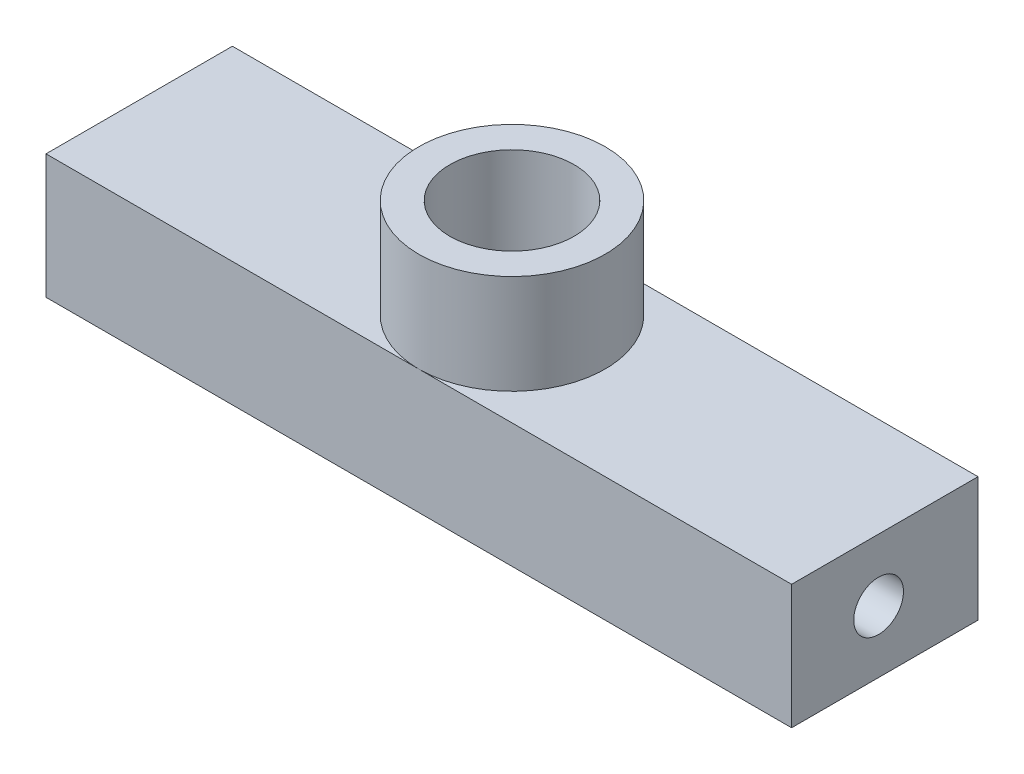
ISO-10303-21;
HEADER;
FILE_DESCRIPTION(('STEP AP214'),'2;1');
FILE_NAME('part.step','',(''),(''),'','','');
FILE_SCHEMA(('AUTOMOTIVE_DESIGN { 1 0 10303 214 1 1 1 1 }'));
ENDSEC;
DATA;
#1=APPLICATION_CONTEXT('core data for automotive mechanical design processes');
#2=APPLICATION_PROTOCOL_DEFINITION('international standard','automotive_design',2000,#1);
#3=PRODUCT_CONTEXT('',#1,'mechanical');
#4=PRODUCT('Part','Part','',(#3));
#5=PRODUCT_RELATED_PRODUCT_CATEGORY('part','',(#4));
#6=PRODUCT_DEFINITION_FORMATION('','',#4);
#7=PRODUCT_DEFINITION_CONTEXT('part definition',#1,'design');
#8=PRODUCT_DEFINITION('design','',#6,#7);
#9=PRODUCT_DEFINITION_SHAPE('','',#8);
#10=(LENGTH_UNIT() NAMED_UNIT(*) SI_UNIT(.MILLI.,.METRE.));
#11=(NAMED_UNIT(*) PLANE_ANGLE_UNIT() SI_UNIT($,.RADIAN.));
#12=(NAMED_UNIT(*) SI_UNIT($,.STERADIAN.) SOLID_ANGLE_UNIT());
#13=UNCERTAINTY_MEASURE_WITH_UNIT(LENGTH_MEASURE(1.E-05),#10,'distance_accuracy_value','');
#14=(GEOMETRIC_REPRESENTATION_CONTEXT(3) GLOBAL_UNCERTAINTY_ASSIGNED_CONTEXT((#13)) GLOBAL_UNIT_ASSIGNED_CONTEXT((#10,
#11,#12)) REPRESENTATION_CONTEXT('',''));
#15=CARTESIAN_POINT('',(0.,0.,0.));
#16=DIRECTION('',(0.,0.,1.));
#17=DIRECTION('',(1.,0.,0.));
#18=AXIS2_PLACEMENT_3D('',#15,#16,#17);
#19=CARTESIAN_POINT('',(0.,9.,0.));
#20=DIRECTION('',(0.,-1.,0.));
#21=DIRECTION('',(0.,0.,-1.));
#22=AXIS2_PLACEMENT_3D('',#19,#20,#21);
#23=CYLINDRICAL_SURFACE('',#22,1.75);
#24=CARTESIAN_POINT('',(0.,5.,0.));
#25=DIRECTION('',(0.,1.,0.));
#26=DIRECTION('',(0.,0.,1.));
#27=AXIS2_PLACEMENT_3D('',#24,#25,#26);
#28=CIRCLE('',#27,1.75);
#29=CARTESIAN_POINT('',(0.,5.,1.75));
#30=VERTEX_POINT('',#29);
#31=EDGE_CURVE('E181',#30,#30,#28,.T.);
#32=ORIENTED_EDGE('',*,*,#31,.T.);
#33=EDGE_LOOP('',(#32));
#34=FACE_BOUND('',#33,.T.);
#35=CARTESIAN_POINT('',(0.,4.,0.));
#36=DIRECTION('',(0.,-1.,0.));
#37=DIRECTION('',(0.,0.,-1.));
#38=AXIS2_PLACEMENT_3D('',#35,#36,#37);
#39=CIRCLE('',#38,1.75);
#40=CARTESIAN_POINT('',(0.,4.,-1.75));
#41=VERTEX_POINT('',#40);
#42=EDGE_CURVE('E37',#41,#41,#39,.F.);
#43=ORIENTED_EDGE('',*,*,#42,.F.);
#44=EDGE_LOOP('',(#43));
#45=FACE_BOUND('',#44,.T.);
#46=ADVANCED_FACE('F33',(#34,#45),#23,.F.);
#47=CARTESIAN_POINT('',(0.,5.,0.));
#48=DIRECTION('',(0.,1.,0.));
#49=DIRECTION('',(0.,0.,1.));
#50=AXIS2_PLACEMENT_3D('',#47,#48,#49);
#51=PLANE('',#50);
#52=CARTESIAN_POINT('',(0.,5.,0.));
#53=DIRECTION('',(0.,1.,0.));
#54=DIRECTION('',(0.,0.,1.));
#55=AXIS2_PLACEMENT_3D('',#52,#53,#54);
#56=CIRCLE('',#55,3.75);
#57=CARTESIAN_POINT('',(0.,5.,3.75));
#58=VERTEX_POINT('',#57);
#59=CARTESIAN_POINT('',(0.,5.,-3.75));
#60=VERTEX_POINT('',#59);
#61=EDGE_CURVE('E44',#58,#60,#56,.T.);
#62=ORIENTED_EDGE('',*,*,#61,.F.);
#63=DIRECTION('',(1.,0.,0.));
#64=VECTOR('',#63,1.);
#65=CARTESIAN_POINT('',(-15.,5.,3.75));
#66=LINE('',#65,#64);
#67=CARTESIAN_POINT('',(15.,5.,3.75));
#68=VERTEX_POINT('',#67);
#69=EDGE_CURVE('E58',#58,#68,#66,.T.);
#70=ORIENTED_EDGE('',*,*,#69,.T.);
#71=DIRECTION('',(0.,0.,-1.));
#72=VECTOR('',#71,1.);
#73=CARTESIAN_POINT('',(15.,5.,-3.75));
#74=LINE('',#73,#72);
#75=CARTESIAN_POINT('',(15.,5.,-3.75));
#76=VERTEX_POINT('',#75);
#77=EDGE_CURVE('E185',#68,#76,#74,.T.);
#78=ORIENTED_EDGE('',*,*,#77,.T.);
#79=DIRECTION('',(-1.,0.,0.));
#80=VECTOR('',#79,1.);
#81=CARTESIAN_POINT('',(-15.,5.,-3.75));
#82=LINE('',#81,#80);
#83=EDGE_CURVE('E87',#76,#60,#82,.T.);
#84=ORIENTED_EDGE('',*,*,#83,.T.);
#85=EDGE_LOOP('',(#62,#70,#78,#84));
#86=FACE_BOUND('',#85,.T.);
#87=ADVANCED_FACE('F100',(#86),#51,.T.);
#88=CARTESIAN_POINT('',(15.,5.,-3.75));
#89=DIRECTION('',(-1.,0.,0.));
#90=DIRECTION('',(0.,0.,1.));
#91=AXIS2_PLACEMENT_3D('',#88,#89,#90);
#92=PLANE('',#91);
#93=CARTESIAN_POINT('',(15.,2.5,0.25));
#94=DIRECTION('',(1.,0.,0.));
#95=DIRECTION('',(0.,0.,-1.));
#96=AXIS2_PLACEMENT_3D('',#93,#94,#95);
#97=CIRCLE('',#96,1.);
#98=CARTESIAN_POINT('',(15.,2.5,-0.75));
#99=VERTEX_POINT('',#98);
#100=EDGE_CURVE('E159',#99,#99,#97,.T.);
#101=ORIENTED_EDGE('',*,*,#100,.F.);
#102=EDGE_LOOP('',(#101));
#103=FACE_BOUND('',#102,.T.);
#104=DIRECTION('',(0.,0.,-1.));
#105=VECTOR('',#104,1.);
#106=CARTESIAN_POINT('',(15.,0.,-3.75));
#107=LINE('',#106,#105);
#108=CARTESIAN_POINT('',(15.,0.,3.75));
#109=VERTEX_POINT('',#108);
#110=CARTESIAN_POINT('',(15.,0.,-3.75));
#111=VERTEX_POINT('',#110);
#112=EDGE_CURVE('E183',#109,#111,#107,.T.);
#113=ORIENTED_EDGE('',*,*,#112,.T.);
#114=DIRECTION('',(0.,-1.,0.));
#115=VECTOR('',#114,1.);
#116=CARTESIAN_POINT('',(15.,5.,-3.75));
#117=LINE('',#116,#115);
#118=EDGE_CURVE('E42',#76,#111,#117,.T.);
#119=ORIENTED_EDGE('',*,*,#118,.F.);
#120=ORIENTED_EDGE('',*,*,#77,.F.);
#121=DIRECTION('',(0.,-1.,0.));
#122=VECTOR('',#121,1.);
#123=CARTESIAN_POINT('',(15.,5.,3.75));
#124=LINE('',#123,#122);
#125=EDGE_CURVE('E95',#68,#109,#124,.T.);
#126=ORIENTED_EDGE('',*,*,#125,.T.);
#127=EDGE_LOOP('',(#113,#119,#120,#126));
#128=FACE_BOUND('',#127,.T.);
#129=ADVANCED_FACE('F35',(#103,#128),#92,.F.);
#130=CARTESIAN_POINT('',(-15.,5.,-3.75));
#131=DIRECTION('',(0.,0.,1.));
#132=DIRECTION('',(1.,0.,0.));
#133=AXIS2_PLACEMENT_3D('',#130,#131,#132);
#134=PLANE('',#133);
#135=DIRECTION('',(-1.,0.,0.));
#136=VECTOR('',#135,1.);
#137=CARTESIAN_POINT('',(-15.,0.,-3.75));
#138=LINE('',#137,#136);
#139=CARTESIAN_POINT('',(-15.,0.,-3.75));
#140=VERTEX_POINT('',#139);
#141=EDGE_CURVE('E192',#111,#140,#138,.T.);
#142=ORIENTED_EDGE('',*,*,#141,.T.);
#143=DIRECTION('',(0.,-1.,0.));
#144=VECTOR('',#143,1.);
#145=CARTESIAN_POINT('',(-15.,5.,-3.75));
#146=LINE('',#145,#144);
#147=CARTESIAN_POINT('',(-15.,5.,-3.75));
#148=VERTEX_POINT('',#147);
#149=EDGE_CURVE('E200',#148,#140,#146,.T.);
#150=ORIENTED_EDGE('',*,*,#149,.F.);
#151=EDGE_CURVE('E187',#60,#148,#82,.T.);
#152=ORIENTED_EDGE('',*,*,#151,.F.);
#153=ORIENTED_EDGE('',*,*,#83,.F.);
#154=ORIENTED_EDGE('',*,*,#118,.T.);
#155=EDGE_LOOP('',(#142,#150,#152,#153,#154));
#156=FACE_BOUND('',#155,.T.);
#157=ADVANCED_FACE('F226',(#156),#134,.F.);
#158=CARTESIAN_POINT('',(-15.,5.,-3.75));
#159=DIRECTION('',(1.,0.,0.));
#160=DIRECTION('',(0.,0.,-1.));
#161=AXIS2_PLACEMENT_3D('',#158,#159,#160);
#162=PLANE('',#161);
#163=CARTESIAN_POINT('',(-15.,2.5,0.250000000000007));
#164=DIRECTION('',(-1.,0.,0.));
#165=DIRECTION('',(0.,0.,1.));
#166=AXIS2_PLACEMENT_3D('',#163,#164,#165);
#167=CIRCLE('',#166,1.);
#168=CARTESIAN_POINT('',(-15.,2.5,1.25000000000001));
#169=VERTEX_POINT('',#168);
#170=EDGE_CURVE('E160',#169,#169,#167,.T.);
#171=ORIENTED_EDGE('',*,*,#170,.F.);
#172=EDGE_LOOP('',(#171));
#173=FACE_BOUND('',#172,.T.);
#174=DIRECTION('',(0.,0.,1.));
#175=VECTOR('',#174,1.);
#176=CARTESIAN_POINT('',(-15.,0.,-3.75));
#177=LINE('',#176,#175);
#178=CARTESIAN_POINT('',(-15.,0.,3.75));
#179=VERTEX_POINT('',#178);
#180=EDGE_CURVE('E194',#140,#179,#177,.T.);
#181=ORIENTED_EDGE('',*,*,#180,.T.);
#182=DIRECTION('',(0.,-1.,0.));
#183=VECTOR('',#182,1.);
#184=CARTESIAN_POINT('',(-15.,5.,3.75));
#185=LINE('',#184,#183);
#186=CARTESIAN_POINT('',(-15.,5.,3.75));
#187=VERTEX_POINT('',#186);
#188=EDGE_CURVE('E198',#187,#179,#185,.T.);
#189=ORIENTED_EDGE('',*,*,#188,.F.);
#190=DIRECTION('',(0.,0.,1.));
#191=VECTOR('',#190,1.);
#192=CARTESIAN_POINT('',(-15.,5.,-3.75));
#193=LINE('',#192,#191);
#194=EDGE_CURVE('E93',#148,#187,#193,.T.);
#195=ORIENTED_EDGE('',*,*,#194,.F.);
#196=ORIENTED_EDGE('',*,*,#149,.T.);
#197=EDGE_LOOP('',(#181,#189,#195,#196));
#198=FACE_BOUND('',#197,.T.);
#199=ADVANCED_FACE('F221',(#173,#198),#162,.F.);
#200=CARTESIAN_POINT('',(-15.,5.,3.75));
#201=DIRECTION('',(0.,0.,-1.));
#202=DIRECTION('',(-1.,0.,0.));
#203=AXIS2_PLACEMENT_3D('',#200,#201,#202);
#204=PLANE('',#203);
#205=DIRECTION('',(1.,0.,0.));
#206=VECTOR('',#205,1.);
#207=CARTESIAN_POINT('',(-15.,0.,3.75));
#208=LINE('',#207,#206);
#209=EDGE_CURVE('E80',#179,#109,#208,.T.);
#210=ORIENTED_EDGE('',*,*,#209,.T.);
#211=ORIENTED_EDGE('',*,*,#125,.F.);
#212=ORIENTED_EDGE('',*,*,#69,.F.);
#213=EDGE_CURVE('E90',#187,#58,#66,.T.);
#214=ORIENTED_EDGE('',*,*,#213,.F.);
#215=ORIENTED_EDGE('',*,*,#188,.T.);
#216=EDGE_LOOP('',(#210,#211,#212,#214,#215));
#217=FACE_BOUND('',#216,.T.);
#218=ADVANCED_FACE('F97',(#217),#204,.F.);
#219=EDGE_CURVE('E11',#60,#58,#56,.T.);
#220=ORIENTED_EDGE('',*,*,#219,.F.);
#221=ORIENTED_EDGE('',*,*,#151,.T.);
#222=ORIENTED_EDGE('',*,*,#194,.T.);
#223=ORIENTED_EDGE('',*,*,#213,.T.);
#224=EDGE_LOOP('',(#220,#221,#222,#223));
#225=FACE_BOUND('',#224,.T.);
#226=ADVANCED_FACE('F91',(#225),#51,.T.);
#227=CARTESIAN_POINT('',(0.,0.,0.));
#228=DIRECTION('',(0.,1.,0.));
#229=DIRECTION('',(0.,0.,1.));
#230=AXIS2_PLACEMENT_3D('',#227,#228,#229);
#231=PLANE('',#230);
#232=CARTESIAN_POINT('',(0.,0.,0.));
#233=DIRECTION('',(0.,-1.,0.));
#234=DIRECTION('',(0.,0.,-1.));
#235=AXIS2_PLACEMENT_3D('',#232,#233,#234);
#236=CIRCLE('',#235,2.5);
#237=CARTESIAN_POINT('',(0.,0.,-2.5));
#238=VERTEX_POINT('',#237);
#239=EDGE_CURVE('E169',#238,#238,#236,.T.);
#240=ORIENTED_EDGE('',*,*,#239,.F.);
#241=EDGE_LOOP('',(#240));
#242=FACE_BOUND('',#241,.T.);
#243=ORIENTED_EDGE('',*,*,#112,.F.);
#244=ORIENTED_EDGE('',*,*,#209,.F.);
#245=ORIENTED_EDGE('',*,*,#180,.F.);
#246=ORIENTED_EDGE('',*,*,#141,.F.);
#247=EDGE_LOOP('',(#243,#244,#245,#246));
#248=FACE_BOUND('',#247,.T.);
#249=ADVANCED_FACE('F117',(#242,#248),#231,.F.);
#250=CARTESIAN_POINT('',(0.,9.,0.));
#251=DIRECTION('',(0.,1.,0.));
#252=DIRECTION('',(0.,0.,1.));
#253=AXIS2_PLACEMENT_3D('',#250,#251,#252);
#254=PLANE('',#253);
#255=CARTESIAN_POINT('',(0.,9.,0.));
#256=DIRECTION('',(0.,1.,0.));
#257=DIRECTION('',(0.,0.,1.));
#258=AXIS2_PLACEMENT_3D('',#255,#256,#257);
#259=CIRCLE('',#258,3.75);
#260=CARTESIAN_POINT('',(0.,9.,3.75));
#261=VERTEX_POINT('',#260);
#262=EDGE_CURVE('E102',#261,#261,#259,.T.);
#263=ORIENTED_EDGE('',*,*,#262,.T.);
#264=EDGE_LOOP('',(#263));
#265=FACE_BOUND('',#264,.T.);
#266=CARTESIAN_POINT('',(0.,9.,0.));
#267=DIRECTION('',(0.,1.,0.));
#268=DIRECTION('',(0.,0.,1.));
#269=AXIS2_PLACEMENT_3D('',#266,#267,#268);
#270=CIRCLE('',#269,2.5);
#271=CARTESIAN_POINT('',(0.,9.,2.5));
#272=VERTEX_POINT('',#271);
#273=EDGE_CURVE('E103',#272,#272,#270,.T.);
#274=ORIENTED_EDGE('',*,*,#273,.F.);
#275=EDGE_LOOP('',(#274));
#276=FACE_BOUND('',#275,.T.);
#277=ADVANCED_FACE('F107',(#265,#276),#254,.T.);
#278=CARTESIAN_POINT('',(0.,9.,0.));
#279=DIRECTION('',(0.,-1.,0.));
#280=DIRECTION('',(0.,0.,-1.));
#281=AXIS2_PLACEMENT_3D('',#278,#279,#280);
#282=CYLINDRICAL_SURFACE('',#281,3.75);
#283=ORIENTED_EDGE('',*,*,#262,.F.);
#284=EDGE_LOOP('',(#283));
#285=FACE_BOUND('',#284,.T.);
#286=ORIENTED_EDGE('',*,*,#61,.T.);
#287=ORIENTED_EDGE('',*,*,#219,.T.);
#288=EDGE_LOOP('',(#286,#287));
#289=FACE_BOUND('',#288,.T.);
#290=ADVANCED_FACE('F104',(#285,#289),#282,.T.);
#291=CARTESIAN_POINT('',(0.,9.,0.));
#292=DIRECTION('',(0.,-1.,0.));
#293=DIRECTION('',(0.,0.,-1.));
#294=AXIS2_PLACEMENT_3D('',#291,#292,#293);
#295=CYLINDRICAL_SURFACE('',#294,2.5);
#296=ORIENTED_EDGE('',*,*,#273,.T.);
#297=EDGE_LOOP('',(#296));
#298=FACE_BOUND('',#297,.T.);
#299=CARTESIAN_POINT('',(0.,5.,0.));
#300=DIRECTION('',(0.,1.,0.));
#301=DIRECTION('',(0.,0.,1.));
#302=AXIS2_PLACEMENT_3D('',#299,#300,#301);
#303=CIRCLE('',#302,2.5);
#304=CARTESIAN_POINT('',(0.,5.,2.5));
#305=VERTEX_POINT('',#304);
#306=EDGE_CURVE('E178',#305,#305,#303,.T.);
#307=ORIENTED_EDGE('',*,*,#306,.F.);
#308=EDGE_LOOP('',(#307));
#309=FACE_BOUND('',#308,.T.);
#310=ADVANCED_FACE('F106',(#298,#309),#295,.F.);
#311=ORIENTED_EDGE('',*,*,#31,.F.);
#312=EDGE_LOOP('',(#311));
#313=FACE_BOUND('',#312,.T.);
#314=ORIENTED_EDGE('',*,*,#306,.T.);
#315=EDGE_LOOP('',(#314));
#316=FACE_BOUND('',#315,.T.);
#317=ADVANCED_FACE('F114',(#313,#316),#51,.T.);
#318=CARTESIAN_POINT('',(0.,4.,0.));
#319=DIRECTION('',(0.,-1.,0.));
#320=DIRECTION('',(0.,0.,-1.));
#321=AXIS2_PLACEMENT_3D('',#318,#319,#320);
#322=PLANE('',#321);
#323=CARTESIAN_POINT('',(0.,4.,0.));
#324=DIRECTION('',(0.,-1.,0.));
#325=DIRECTION('',(0.,0.,-1.));
#326=AXIS2_PLACEMENT_3D('',#323,#324,#325);
#327=CIRCLE('',#326,2.5);
#328=CARTESIAN_POINT('',(0.,4.,-2.5));
#329=VERTEX_POINT('',#328);
#330=EDGE_CURVE('E171',#329,#329,#327,.T.);
#331=ORIENTED_EDGE('',*,*,#330,.T.);
#332=EDGE_LOOP('',(#331));
#333=FACE_BOUND('',#332,.T.);
#334=ORIENTED_EDGE('',*,*,#42,.T.);
#335=EDGE_LOOP('',(#334));
#336=FACE_BOUND('',#335,.T.);
#337=ADVANCED_FACE('F135',(#333,#336),#322,.T.);
#338=CARTESIAN_POINT('',(0.,4.,0.));
#339=DIRECTION('',(0.,-1.,0.));
#340=DIRECTION('',(0.,0.,-1.));
#341=AXIS2_PLACEMENT_3D('',#338,#339,#340);
#342=CYLINDRICAL_SURFACE('',#341,2.5);
#343=ORIENTED_EDGE('',*,*,#330,.F.);
#344=EDGE_LOOP('',(#343));
#345=FACE_BOUND('',#344,.T.);
#346=ORIENTED_EDGE('',*,*,#239,.T.);
#347=EDGE_LOOP('',(#346));
#348=FACE_BOUND('',#347,.T.);
#349=ADVANCED_FACE('F131',(#345,#348),#342,.F.);
#350=CARTESIAN_POINT('',(5.,2.5,0.25));
#351=DIRECTION('',(1.,0.,0.));
#352=DIRECTION('',(0.,0.,-1.));
#353=AXIS2_PLACEMENT_3D('',#350,#351,#352);
#354=CYLINDRICAL_SURFACE('',#353,1.);
#355=CARTESIAN_POINT('',(5.,2.5,0.25));
#356=DIRECTION('',(1.,0.,0.));
#357=DIRECTION('',(0.,0.,-1.));
#358=AXIS2_PLACEMENT_3D('',#355,#356,#357);
#359=CIRCLE('',#358,1.);
#360=CARTESIAN_POINT('',(5.,2.5,-0.75));
#361=VERTEX_POINT('',#360);
#362=EDGE_CURVE('E163',#361,#361,#359,.T.);
#363=ORIENTED_EDGE('',*,*,#362,.F.);
#364=EDGE_LOOP('',(#363));
#365=FACE_BOUND('',#364,.T.);
#366=ORIENTED_EDGE('',*,*,#100,.T.);
#367=EDGE_LOOP('',(#366));
#368=FACE_BOUND('',#367,.T.);
#369=ADVANCED_FACE('F134',(#365,#368),#354,.F.);
#370=CARTESIAN_POINT('',(5.,2.5,0.25));
#371=DIRECTION('',(1.,0.,0.));
#372=DIRECTION('',(0.,0.,-1.));
#373=AXIS2_PLACEMENT_3D('',#370,#371,#372);
#374=PLANE('',#373);
#375=ORIENTED_EDGE('',*,*,#362,.T.);
#376=EDGE_LOOP('',(#375));
#377=FACE_BOUND('',#376,.T.);
#378=ADVANCED_FACE('F142',(#377),#374,.T.);
#379=CARTESIAN_POINT('',(-5.,2.5,0.250000000000003));
#380=DIRECTION('',(-1.,0.,0.));
#381=DIRECTION('',(0.,0.,1.));
#382=AXIS2_PLACEMENT_3D('',#379,#380,#381);
#383=CYLINDRICAL_SURFACE('',#382,1.);
#384=CARTESIAN_POINT('',(-5.,2.5,0.250000000000003));
#385=DIRECTION('',(-1.,0.,0.));
#386=DIRECTION('',(0.,0.,1.));
#387=AXIS2_PLACEMENT_3D('',#384,#385,#386);
#388=CIRCLE('',#387,1.);
#389=CARTESIAN_POINT('',(-5.,2.5,1.25));
#390=VERTEX_POINT('',#389);
#391=EDGE_CURVE('E158',#390,#390,#388,.T.);
#392=ORIENTED_EDGE('',*,*,#391,.F.);
#393=EDGE_LOOP('',(#392));
#394=FACE_BOUND('',#393,.T.);
#395=ORIENTED_EDGE('',*,*,#170,.T.);
#396=EDGE_LOOP('',(#395));
#397=FACE_BOUND('',#396,.T.);
#398=ADVANCED_FACE('F146',(#394,#397),#383,.F.);
#399=CARTESIAN_POINT('',(-5.,2.5,0.250000000000003));
#400=DIRECTION('',(-1.,0.,0.));
#401=DIRECTION('',(0.,0.,1.));
#402=AXIS2_PLACEMENT_3D('',#399,#400,#401);
#403=PLANE('',#402);
#404=ORIENTED_EDGE('',*,*,#391,.T.);
#405=EDGE_LOOP('',(#404));
#406=FACE_BOUND('',#405,.T.);
#407=ADVANCED_FACE('F150',(#406),#403,.T.);
#408=CLOSED_SHELL('',(#46,#87,#129,#157,#199,#218,#226,#249,#277,#290,#310,#317,#337,#349,#369,
#378,#398,#407));
#409=MANIFOLD_SOLID_BREP('B2',#408);
#410=ADVANCED_BREP_SHAPE_REPRESENTATION('',(#18,#409),#14);
#411=SHAPE_DEFINITION_REPRESENTATION(#9,#410);
ENDSEC;
END-ISO-10303-21;
